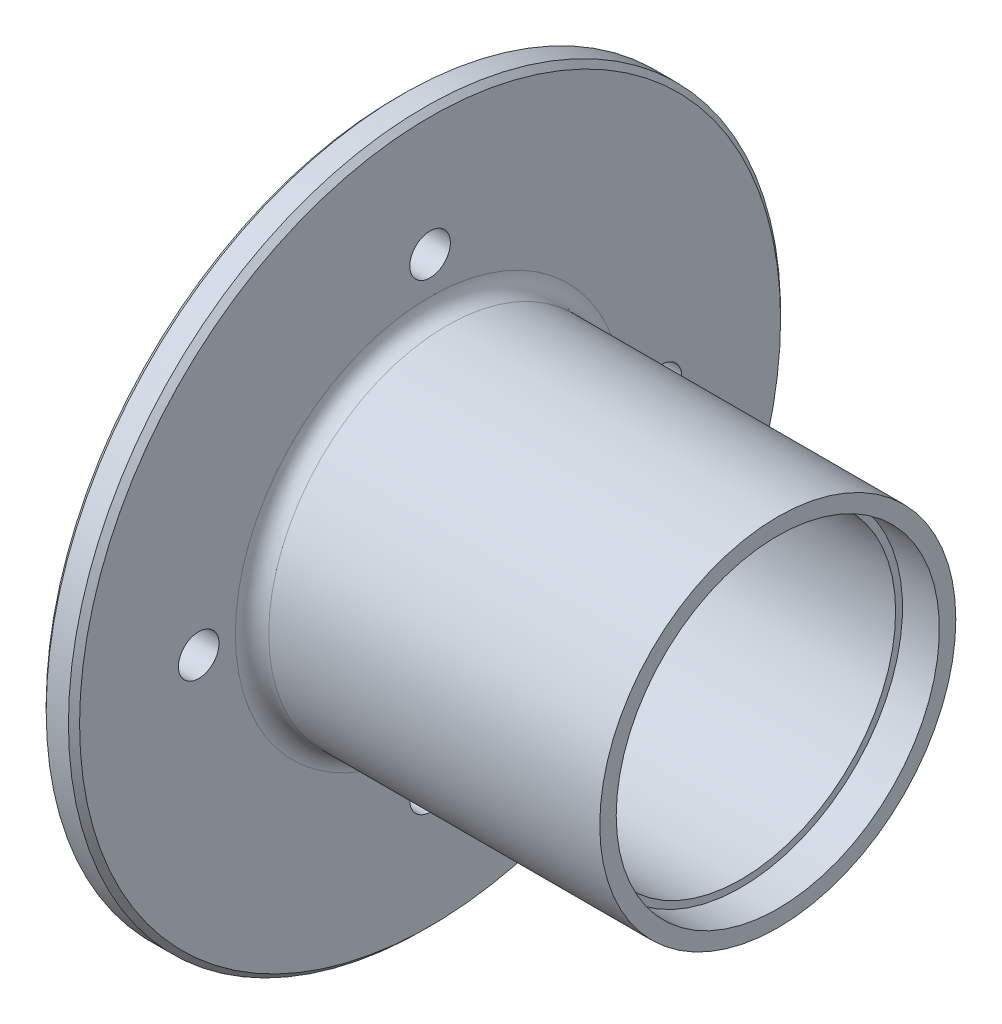
ISO-10303-21;
HEADER;
FILE_DESCRIPTION(('STEP AP214'),'2;1');
FILE_NAME('part.step','',(''),(''),'','','');
FILE_SCHEMA(('AUTOMOTIVE_DESIGN { 1 0 10303 214 1 1 1 1 }'));
ENDSEC;
DATA;
#1=APPLICATION_CONTEXT('core data for automotive mechanical design processes');
#2=APPLICATION_PROTOCOL_DEFINITION('international standard','automotive_design',2000,#1);
#3=PRODUCT_CONTEXT('',#1,'mechanical');
#4=PRODUCT('Part','Part','',(#3));
#5=PRODUCT_RELATED_PRODUCT_CATEGORY('part','',(#4));
#6=PRODUCT_DEFINITION_FORMATION('','',#4);
#7=PRODUCT_DEFINITION_CONTEXT('part definition',#1,'design');
#8=PRODUCT_DEFINITION('design','',#6,#7);
#9=PRODUCT_DEFINITION_SHAPE('','',#8);
#10=(LENGTH_UNIT() NAMED_UNIT(*) SI_UNIT(.MILLI.,.METRE.));
#11=(NAMED_UNIT(*) PLANE_ANGLE_UNIT() SI_UNIT($,.RADIAN.));
#12=(NAMED_UNIT(*) SI_UNIT($,.STERADIAN.) SOLID_ANGLE_UNIT());
#13=UNCERTAINTY_MEASURE_WITH_UNIT(LENGTH_MEASURE(1.E-05),#10,'distance_accuracy_value','');
#14=(GEOMETRIC_REPRESENTATION_CONTEXT(3) GLOBAL_UNCERTAINTY_ASSIGNED_CONTEXT((#13)) GLOBAL_UNIT_ASSIGNED_CONTEXT((#10,
#11,#12)) REPRESENTATION_CONTEXT('',''));
#15=CARTESIAN_POINT('',(0.,0.,0.));
#16=DIRECTION('',(0.,0.,1.));
#17=DIRECTION('',(1.,0.,0.));
#18=AXIS2_PLACEMENT_3D('',#15,#16,#17);
#19=CARTESIAN_POINT('',(57.7375730817676,23.0621980210306,0.));
#20=DIRECTION('',(-1.,0.,0.));
#21=DIRECTION('',(0.,0.,1.));
#22=AXIS2_PLACEMENT_3D('',#19,#20,#21);
#23=PLANE('',#22);
#24=CARTESIAN_POINT('',(57.7375730817676,0.,0.));
#25=DIRECTION('',(-1.,0.,0.));
#26=DIRECTION('',(0.,0.,1.));
#27=AXIS2_PLACEMENT_3D('',#24,#25,#26);
#28=CIRCLE('',#27,25.4102543094673);
#29=CARTESIAN_POINT('',(57.7375730817676,0.,25.4102543094673));
#30=VERTEX_POINT('',#29);
#31=EDGE_CURVE('E10',#30,#30,#28,.T.);
#32=ORIENTED_EDGE('',*,*,#31,.F.);
#33=EDGE_LOOP('',(#32));
#34=FACE_BOUND('',#33,.T.);
#35=CARTESIAN_POINT('',(57.7375730817676,0.,0.));
#36=DIRECTION('',(-1.,0.,0.));
#37=DIRECTION('',(0.,0.,1.));
#38=AXIS2_PLACEMENT_3D('',#35,#36,#37);
#39=CIRCLE('',#38,23.0621980210306);
#40=CARTESIAN_POINT('',(57.7375730817676,0.,23.0621980210306));
#41=VERTEX_POINT('',#40);
#42=EDGE_CURVE('E100',#41,#41,#39,.T.);
#43=ORIENTED_EDGE('',*,*,#42,.T.);
#44=EDGE_LOOP('',(#43));
#45=FACE_BOUND('',#44,.T.);
#46=ADVANCED_FACE('F37',(#34,#45),#23,.F.);
#47=CARTESIAN_POINT('',(0.,0.,0.));
#48=DIRECTION('',(-1.,0.,0.));
#49=DIRECTION('',(0.,0.,1.));
#50=AXIS2_PLACEMENT_3D('',#47,#48,#49);
#51=CYLINDRICAL_SURFACE('',#50,25.4102543094673);
#52=CARTESIAN_POINT('',(10.4935730817675,0.,0.));
#53=DIRECTION('',(-1.,0.,0.));
#54=DIRECTION('',(0.,0.,1.));
#55=AXIS2_PLACEMENT_3D('',#52,#53,#54);
#56=CIRCLE('',#55,25.4102543094673);
#57=CARTESIAN_POINT('',(10.4935730817675,0.,25.4102543094673));
#58=VERTEX_POINT('',#57);
#59=EDGE_CURVE('E44',#58,#58,#56,.T.);
#60=ORIENTED_EDGE('',*,*,#59,.F.);
#61=EDGE_LOOP('',(#60));
#62=FACE_BOUND('',#61,.T.);
#63=ORIENTED_EDGE('',*,*,#31,.T.);
#64=EDGE_LOOP('',(#63));
#65=FACE_BOUND('',#64,.T.);
#66=ADVANCED_FACE('F182',(#62,#65),#51,.T.);
#67=CARTESIAN_POINT('',(10.4935730817675,0.,0.));
#68=DIRECTION('',(-1.,0.,0.));
#69=DIRECTION('',(0.,0.,1.));
#70=AXIS2_PLACEMENT_3D('',#67,#68,#69);
#71=TOROIDAL_SURFACE('',#70,27.7924656509799,2.38221134151256);
#72=ORIENTED_EDGE('',*,*,#59,.T.);
#73=EDGE_LOOP('',(#72));
#74=FACE_BOUND('',#73,.T.);
#75=CARTESIAN_POINT('',(8.11136174025498,0.,0.));
#76=DIRECTION('',(-1.,0.,0.));
#77=DIRECTION('',(0.,0.,1.));
#78=AXIS2_PLACEMENT_3D('',#75,#76,#77);
#79=CIRCLE('',#78,27.7924656509799);
#80=CARTESIAN_POINT('',(8.11136174025498,0.,27.7924656509799));
#81=VERTEX_POINT('',#80);
#82=EDGE_CURVE('E49',#81,#81,#79,.T.);
#83=ORIENTED_EDGE('',*,*,#82,.F.);
#84=EDGE_LOOP('',(#83));
#85=FACE_BOUND('',#84,.T.);
#86=ADVANCED_FACE('F176',(#74,#85),#71,.F.);
#87=CARTESIAN_POINT('',(8.11136174025498,27.7924656509799,0.));
#88=DIRECTION('',(-1.,0.,0.));
#89=DIRECTION('',(0.,0.,1.));
#90=AXIS2_PLACEMENT_3D('',#87,#88,#89);
#91=PLANE('',#90);
#92=CARTESIAN_POINT('',(8.11136174025498,3.45866141425801E-13,33.02));
#93=DIRECTION('',(-1.,0.,0.));
#94=DIRECTION('',(0.,0.,1.));
#95=AXIS2_PLACEMENT_3D('',#92,#93,#94);
#96=CIRCLE('',#95,2.8956);
#97=CARTESIAN_POINT('',(8.11136174025498,3.45866141425801E-13,35.9156));
#98=VERTEX_POINT('',#97);
#99=EDGE_CURVE('E128',#98,#98,#96,.T.);
#100=ORIENTED_EDGE('',*,*,#99,.T.);
#101=EDGE_LOOP('',(#100));
#102=FACE_BOUND('',#101,.T.);
#103=CARTESIAN_POINT('',(8.11136174025498,-33.02,0.));
#104=DIRECTION('',(-1.,0.,0.));
#105=DIRECTION('',(0.,0.,1.));
#106=AXIS2_PLACEMENT_3D('',#103,#104,#105);
#107=CIRCLE('',#106,2.8956);
#108=CARTESIAN_POINT('',(8.11136174025498,-33.02,2.8956));
#109=VERTEX_POINT('',#108);
#110=EDGE_CURVE('E120',#109,#109,#107,.T.);
#111=ORIENTED_EDGE('',*,*,#110,.T.);
#112=EDGE_LOOP('',(#111));
#113=FACE_BOUND('',#112,.T.);
#114=CARTESIAN_POINT('',(8.11136174025498,-1.152887138086E-13,-33.02));
#115=DIRECTION('',(-1.,0.,0.));
#116=DIRECTION('',(0.,0.,1.));
#117=AXIS2_PLACEMENT_3D('',#114,#115,#116);
#118=CIRCLE('',#117,2.8956);
#119=CARTESIAN_POINT('',(8.11136174025498,-1.152887138086E-13,-30.1244));
#120=VERTEX_POINT('',#119);
#121=EDGE_CURVE('E112',#120,#120,#118,.T.);
#122=ORIENTED_EDGE('',*,*,#121,.T.);
#123=EDGE_LOOP('',(#122));
#124=FACE_BOUND('',#123,.T.);
#125=CARTESIAN_POINT('',(8.11136174025498,33.02,0.));
#126=DIRECTION('',(-1.,0.,0.));
#127=DIRECTION('',(0.,0.,1.));
#128=AXIS2_PLACEMENT_3D('',#125,#126,#127);
#129=CIRCLE('',#128,2.89559999999999);
#130=CARTESIAN_POINT('',(8.11136174025498,33.02,2.89559999999999));
#131=VERTEX_POINT('',#130);
#132=EDGE_CURVE('E104',#131,#131,#129,.T.);
#133=ORIENTED_EDGE('',*,*,#132,.T.);
#134=EDGE_LOOP('',(#133));
#135=FACE_BOUND('',#134,.T.);
#136=CARTESIAN_POINT('',(8.11136174025498,0.,0.));
#137=DIRECTION('',(-1.,0.,0.));
#138=DIRECTION('',(0.,0.,1.));
#139=AXIS2_PLACEMENT_3D('',#136,#137,#138);
#140=CIRCLE('',#139,50.0264381717638);
#141=CARTESIAN_POINT('',(8.11136174025498,0.,50.0264381717638));
#142=VERTEX_POINT('',#141);
#143=EDGE_CURVE('E54',#142,#142,#140,.T.);
#144=ORIENTED_EDGE('',*,*,#143,.F.);
#145=EDGE_LOOP('',(#144));
#146=FACE_BOUND('',#145,.T.);
#147=ORIENTED_EDGE('',*,*,#82,.T.);
#148=EDGE_LOOP('',(#147));
#149=FACE_BOUND('',#148,.T.);
#150=ADVANCED_FACE('F170',(#102,#113,#124,#135,#146,#149),#91,.F.);
#151=CARTESIAN_POINT('',(8.11136174025498,0.,0.));
#152=DIRECTION('',(-1.,0.,0.));
#153=DIRECTION('',(0.,0.,1.));
#154=AXIS2_PLACEMENT_3D('',#151,#152,#153);
#155=CONICAL_SURFACE('',#154,50.0264381717638,0.785398163397448);
#156=CARTESIAN_POINT('',(7.31729129308412,0.,0.));
#157=DIRECTION('',(-1.,0.,0.));
#158=DIRECTION('',(0.,0.,1.));
#159=AXIS2_PLACEMENT_3D('',#156,#157,#158);
#160=CIRCLE('',#159,50.8205086189346);
#161=CARTESIAN_POINT('',(7.31729129308412,0.,50.8205086189346));
#162=VERTEX_POINT('',#161);
#163=EDGE_CURVE('E60',#162,#162,#160,.T.);
#164=ORIENTED_EDGE('',*,*,#163,.F.);
#165=EDGE_LOOP('',(#164));
#166=FACE_BOUND('',#165,.T.);
#167=ORIENTED_EDGE('',*,*,#143,.T.);
#168=EDGE_LOOP('',(#167));
#169=FACE_BOUND('',#168,.T.);
#170=ADVANCED_FACE('F164',(#166,#169),#155,.T.);
#171=CARTESIAN_POINT('',(0.,0.,0.));
#172=DIRECTION('',(-1.,0.,0.));
#173=DIRECTION('',(0.,0.,1.));
#174=AXIS2_PLACEMENT_3D('',#171,#172,#173);
#175=CYLINDRICAL_SURFACE('',#174,50.8205086189346);
#176=CARTESIAN_POINT('',(4.14100950440072,0.,0.));
#177=DIRECTION('',(-1.,0.,0.));
#178=DIRECTION('',(0.,0.,1.));
#179=AXIS2_PLACEMENT_3D('',#176,#177,#178);
#180=CIRCLE('',#179,50.8205086189346);
#181=CARTESIAN_POINT('',(4.14100950440072,0.,50.8205086189346));
#182=VERTEX_POINT('',#181);
#183=EDGE_CURVE('E64',#182,#182,#180,.T.);
#184=ORIENTED_EDGE('',*,*,#183,.F.);
#185=EDGE_LOOP('',(#184));
#186=FACE_BOUND('',#185,.T.);
#187=ORIENTED_EDGE('',*,*,#163,.T.);
#188=EDGE_LOOP('',(#187));
#189=FACE_BOUND('',#188,.T.);
#190=ADVANCED_FACE('F158',(#186,#189),#175,.T.);
#191=CARTESIAN_POINT('',(4.14100950440072,0.,0.));
#192=DIRECTION('',(1.,0.,0.));
#193=DIRECTION('',(0.,0.,-1.));
#194=AXIS2_PLACEMENT_3D('',#191,#192,#193);
#195=CONICAL_SURFACE('',#194,50.8205086189346,0.785398163397448);
#196=CARTESIAN_POINT('',(3.34693905722985,0.,0.));
#197=DIRECTION('',(-1.,0.,0.));
#198=DIRECTION('',(0.,0.,1.));
#199=AXIS2_PLACEMENT_3D('',#196,#197,#198);
#200=CIRCLE('',#199,50.0264381717638);
#201=CARTESIAN_POINT('',(3.34693905722985,0.,50.0264381717638));
#202=VERTEX_POINT('',#201);
#203=EDGE_CURVE('E68',#202,#202,#200,.T.);
#204=ORIENTED_EDGE('',*,*,#203,.F.);
#205=EDGE_LOOP('',(#204));
#206=FACE_BOUND('',#205,.T.);
#207=ORIENTED_EDGE('',*,*,#183,.T.);
#208=EDGE_LOOP('',(#207));
#209=FACE_BOUND('',#208,.T.);
#210=ADVANCED_FACE('F144',(#206,#209),#195,.T.);
#211=CARTESIAN_POINT('',(3.34693905722985,50.0264381717638,0.));
#212=DIRECTION('',(1.,0.,0.));
#213=DIRECTION('',(0.,0.,-1.));
#214=AXIS2_PLACEMENT_3D('',#211,#212,#213);
#215=PLANE('',#214);
#216=CARTESIAN_POINT('',(3.34693905722985,3.45866141425801E-13,33.02));
#217=DIRECTION('',(-1.,0.,0.));
#218=DIRECTION('',(0.,0.,1.));
#219=AXIS2_PLACEMENT_3D('',#216,#217,#218);
#220=CIRCLE('',#219,2.8956);
#221=CARTESIAN_POINT('',(3.34693905722985,3.45866141425801E-13,35.9156));
#222=VERTEX_POINT('',#221);
#223=EDGE_CURVE('E132',#222,#222,#220,.T.);
#224=ORIENTED_EDGE('',*,*,#223,.F.);
#225=EDGE_LOOP('',(#224));
#226=FACE_BOUND('',#225,.T.);
#227=CARTESIAN_POINT('',(3.34693905722985,-33.02,0.));
#228=DIRECTION('',(-1.,0.,0.));
#229=DIRECTION('',(0.,0.,1.));
#230=AXIS2_PLACEMENT_3D('',#227,#228,#229);
#231=CIRCLE('',#230,2.8956);
#232=CARTESIAN_POINT('',(3.34693905722985,-33.02,2.8956));
#233=VERTEX_POINT('',#232);
#234=EDGE_CURVE('E124',#233,#233,#231,.T.);
#235=ORIENTED_EDGE('',*,*,#234,.F.);
#236=EDGE_LOOP('',(#235));
#237=FACE_BOUND('',#236,.T.);
#238=CARTESIAN_POINT('',(3.34693905722985,-1.152887138086E-13,-33.02));
#239=DIRECTION('',(-1.,0.,0.));
#240=DIRECTION('',(0.,0.,1.));
#241=AXIS2_PLACEMENT_3D('',#238,#239,#240);
#242=CIRCLE('',#241,2.8956);
#243=CARTESIAN_POINT('',(3.34693905722985,-1.152887138086E-13,-30.1244));
#244=VERTEX_POINT('',#243);
#245=EDGE_CURVE('E116',#244,#244,#242,.T.);
#246=ORIENTED_EDGE('',*,*,#245,.F.);
#247=EDGE_LOOP('',(#246));
#248=FACE_BOUND('',#247,.T.);
#249=CARTESIAN_POINT('',(3.34693905722985,33.02,0.));
#250=DIRECTION('',(-1.,0.,0.));
#251=DIRECTION('',(0.,0.,1.));
#252=AXIS2_PLACEMENT_3D('',#249,#250,#251);
#253=CIRCLE('',#252,2.8956);
#254=CARTESIAN_POINT('',(3.34693905722985,33.02,2.8956));
#255=VERTEX_POINT('',#254);
#256=EDGE_CURVE('E108',#255,#255,#253,.T.);
#257=ORIENTED_EDGE('',*,*,#256,.F.);
#258=EDGE_LOOP('',(#257));
#259=FACE_BOUND('',#258,.T.);
#260=CARTESIAN_POINT('',(3.34693905722985,0.,0.));
#261=DIRECTION('',(-1.,0.,0.));
#262=DIRECTION('',(0.,0.,1.));
#263=AXIS2_PLACEMENT_3D('',#260,#261,#262);
#264=CIRCLE('',#263,17.1502721287435);
#265=CARTESIAN_POINT('',(3.34693905722985,0.,17.1502721287435));
#266=VERTEX_POINT('',#265);
#267=EDGE_CURVE('E72',#266,#266,#264,.T.);
#268=ORIENTED_EDGE('',*,*,#267,.F.);
#269=EDGE_LOOP('',(#268));
#270=FACE_BOUND('',#269,.T.);
#271=ORIENTED_EDGE('',*,*,#203,.T.);
#272=EDGE_LOOP('',(#271));
#273=FACE_BOUND('',#272,.T.);
#274=ADVANCED_FACE('F140',(#226,#237,#248,#259,#270,#273),#215,.F.);
#275=CARTESIAN_POINT('',(3.34693905722985,0.,0.));
#276=DIRECTION('',(-1.,0.,0.));
#277=DIRECTION('',(0.,0.,1.));
#278=AXIS2_PLACEMENT_3D('',#275,#276,#277);
#279=CONICAL_SURFACE('',#278,17.1502721287435,0.767642261232656);
#280=CARTESIAN_POINT('',(8.11136174025498,0.,0.));
#281=DIRECTION('',(-1.,0.,0.));
#282=DIRECTION('',(0.,0.,1.));
#283=AXIS2_PLACEMENT_3D('',#280,#281,#282);
#284=CIRCLE('',#283,12.5521080921244);
#285=CARTESIAN_POINT('',(8.11136174025498,0.,12.5521080921244));
#286=VERTEX_POINT('',#285);
#287=EDGE_CURVE('E76',#286,#286,#284,.T.);
#288=ORIENTED_EDGE('',*,*,#287,.F.);
#289=EDGE_LOOP('',(#288));
#290=FACE_BOUND('',#289,.T.);
#291=ORIENTED_EDGE('',*,*,#267,.T.);
#292=EDGE_LOOP('',(#291));
#293=FACE_BOUND('',#292,.T.);
#294=ADVANCED_FACE('F143',(#290,#293),#279,.F.);
#295=CARTESIAN_POINT('',(8.11136174025498,12.5521080921244,0.));
#296=DIRECTION('',(-1.,0.,0.));
#297=DIRECTION('',(0.,0.,1.));
#298=AXIS2_PLACEMENT_3D('',#295,#296,#297);
#299=PLANE('',#298);
#300=CARTESIAN_POINT('',(8.11136174025498,0.,0.));
#301=DIRECTION('',(-1.,0.,0.));
#302=DIRECTION('',(0.,0.,1.));
#303=AXIS2_PLACEMENT_3D('',#300,#301,#302);
#304=CIRCLE('',#303,17.1502721287435);
#305=CARTESIAN_POINT('',(8.11136174025498,0.,17.1502721287435));
#306=VERTEX_POINT('',#305);
#307=EDGE_CURVE('E80',#306,#306,#304,.T.);
#308=ORIENTED_EDGE('',*,*,#307,.F.);
#309=EDGE_LOOP('',(#308));
#310=FACE_BOUND('',#309,.T.);
#311=ORIENTED_EDGE('',*,*,#287,.T.);
#312=EDGE_LOOP('',(#311));
#313=FACE_BOUND('',#312,.T.);
#314=ADVANCED_FACE('F223',(#310,#313),#299,.F.);
#315=CARTESIAN_POINT('',(0.,0.,0.));
#316=DIRECTION('',(-1.,0.,0.));
#317=DIRECTION('',(0.,0.,1.));
#318=AXIS2_PLACEMENT_3D('',#315,#316,#317);
#319=CYLINDRICAL_SURFACE('',#318,17.1502721287435);
#320=CARTESIAN_POINT('',(23.5579308541441,0.,0.));
#321=DIRECTION('',(-1.,0.,0.));
#322=DIRECTION('',(0.,0.,1.));
#323=AXIS2_PLACEMENT_3D('',#320,#321,#322);
#324=CIRCLE('',#323,17.1502721287435);
#325=CARTESIAN_POINT('',(23.5579308541441,0.,17.1502721287435));
#326=VERTEX_POINT('',#325);
#327=EDGE_CURVE('E84',#326,#326,#324,.T.);
#328=ORIENTED_EDGE('',*,*,#327,.F.);
#329=EDGE_LOOP('',(#328));
#330=FACE_BOUND('',#329,.T.);
#331=ORIENTED_EDGE('',*,*,#307,.T.);
#332=EDGE_LOOP('',(#331));
#333=FACE_BOUND('',#332,.T.);
#334=ADVANCED_FACE('F217',(#330,#333),#319,.F.);
#335=CARTESIAN_POINT('',(23.5579308541441,17.1502721287435,0.));
#336=DIRECTION('',(-1.,0.,0.));
#337=DIRECTION('',(0.,0.,1.));
#338=AXIS2_PLACEMENT_3D('',#335,#336,#337);
#339=PLANE('',#338);
#340=CARTESIAN_POINT('',(23.5579308541441,0.,0.));
#341=DIRECTION('',(-1.,0.,0.));
#342=DIRECTION('',(0.,0.,1.));
#343=AXIS2_PLACEMENT_3D('',#340,#341,#342);
#344=CIRCLE('',#343,22.076877202864);
#345=CARTESIAN_POINT('',(23.5579308541441,0.,22.076877202864));
#346=VERTEX_POINT('',#345);
#347=EDGE_CURVE('E88',#346,#346,#344,.T.);
#348=ORIENTED_EDGE('',*,*,#347,.F.);
#349=EDGE_LOOP('',(#348));
#350=FACE_BOUND('',#349,.T.);
#351=ORIENTED_EDGE('',*,*,#327,.T.);
#352=EDGE_LOOP('',(#351));
#353=FACE_BOUND('',#352,.T.);
#354=ADVANCED_FACE('F211',(#350,#353),#339,.F.);
#355=CARTESIAN_POINT('',(0.,0.,0.));
#356=DIRECTION('',(-1.,0.,0.));
#357=DIRECTION('',(0.,0.,1.));
#358=AXIS2_PLACEMENT_3D('',#355,#356,#357);
#359=CYLINDRICAL_SURFACE('',#358,22.076877202864);
#360=CARTESIAN_POINT('',(52.4791662625277,0.,0.));
#361=DIRECTION('',(-1.,0.,0.));
#362=DIRECTION('',(0.,0.,1.));
#363=AXIS2_PLACEMENT_3D('',#360,#361,#362);
#364=CIRCLE('',#363,22.076877202864);
#365=CARTESIAN_POINT('',(52.4791662625277,0.,22.076877202864));
#366=VERTEX_POINT('',#365);
#367=EDGE_CURVE('E92',#366,#366,#364,.T.);
#368=ORIENTED_EDGE('',*,*,#367,.F.);
#369=EDGE_LOOP('',(#368));
#370=FACE_BOUND('',#369,.T.);
#371=ORIENTED_EDGE('',*,*,#347,.T.);
#372=EDGE_LOOP('',(#371));
#373=FACE_BOUND('',#372,.T.);
#374=ADVANCED_FACE('F205',(#370,#373),#359,.F.);
#375=CARTESIAN_POINT('',(52.4791662625277,22.076877202864,0.));
#376=DIRECTION('',(-1.,0.,0.));
#377=DIRECTION('',(0.,0.,1.));
#378=AXIS2_PLACEMENT_3D('',#375,#376,#377);
#379=PLANE('',#378);
#380=CARTESIAN_POINT('',(52.4791662625277,0.,0.));
#381=DIRECTION('',(-1.,0.,0.));
#382=DIRECTION('',(0.,0.,1.));
#383=AXIS2_PLACEMENT_3D('',#380,#381,#382);
#384=CIRCLE('',#383,23.0621980210306);
#385=CARTESIAN_POINT('',(52.4791662625277,0.,23.0621980210306));
#386=VERTEX_POINT('',#385);
#387=EDGE_CURVE('E96',#386,#386,#384,.T.);
#388=ORIENTED_EDGE('',*,*,#387,.F.);
#389=EDGE_LOOP('',(#388));
#390=FACE_BOUND('',#389,.T.);
#391=ORIENTED_EDGE('',*,*,#367,.T.);
#392=EDGE_LOOP('',(#391));
#393=FACE_BOUND('',#392,.T.);
#394=ADVANCED_FACE('F199',(#390,#393),#379,.F.);
#395=CARTESIAN_POINT('',(0.,0.,0.));
#396=DIRECTION('',(-1.,0.,0.));
#397=DIRECTION('',(0.,0.,1.));
#398=AXIS2_PLACEMENT_3D('',#395,#396,#397);
#399=CYLINDRICAL_SURFACE('',#398,23.0621980210306);
#400=ORIENTED_EDGE('',*,*,#42,.F.);
#401=EDGE_LOOP('',(#400));
#402=FACE_BOUND('',#401,.T.);
#403=ORIENTED_EDGE('',*,*,#387,.T.);
#404=EDGE_LOOP('',(#403));
#405=FACE_BOUND('',#404,.T.);
#406=ADVANCED_FACE('F195',(#402,#405),#399,.F.);
#407=CARTESIAN_POINT('',(3.34693905722985,33.02,0.));
#408=DIRECTION('',(-1.,0.,0.));
#409=DIRECTION('',(0.,0.,1.));
#410=AXIS2_PLACEMENT_3D('',#407,#408,#409);
#411=CYLINDRICAL_SURFACE('',#410,2.89559999999999);
#412=ORIENTED_EDGE('',*,*,#256,.T.);
#413=EDGE_LOOP('',(#412));
#414=FACE_BOUND('',#413,.T.);
#415=ORIENTED_EDGE('',*,*,#132,.F.);
#416=EDGE_LOOP('',(#415));
#417=FACE_BOUND('',#416,.T.);
#418=ADVANCED_FACE('F198',(#414,#417),#411,.F.);
#419=CARTESIAN_POINT('',(3.34693905722985,-1.152887138086E-13,-33.02));
#420=DIRECTION('',(-1.,0.,0.));
#421=DIRECTION('',(0.,0.,1.));
#422=AXIS2_PLACEMENT_3D('',#419,#420,#421);
#423=CYLINDRICAL_SURFACE('',#422,2.8956);
#424=ORIENTED_EDGE('',*,*,#245,.T.);
#425=EDGE_LOOP('',(#424));
#426=FACE_BOUND('',#425,.T.);
#427=ORIENTED_EDGE('',*,*,#121,.F.);
#428=EDGE_LOOP('',(#427));
#429=FACE_BOUND('',#428,.T.);
#430=ADVANCED_FACE('F240',(#426,#429),#423,.F.);
#431=CARTESIAN_POINT('',(3.34693905722985,-33.02,0.));
#432=DIRECTION('',(-1.,0.,0.));
#433=DIRECTION('',(0.,0.,1.));
#434=AXIS2_PLACEMENT_3D('',#431,#432,#433);
#435=CYLINDRICAL_SURFACE('',#434,2.8956);
#436=ORIENTED_EDGE('',*,*,#234,.T.);
#437=EDGE_LOOP('',(#436));
#438=FACE_BOUND('',#437,.T.);
#439=ORIENTED_EDGE('',*,*,#110,.F.);
#440=EDGE_LOOP('',(#439));
#441=FACE_BOUND('',#440,.T.);
#442=ADVANCED_FACE('F244',(#438,#441),#435,.F.);
#443=CARTESIAN_POINT('',(3.34693905722985,3.45866141425801E-13,33.02));
#444=DIRECTION('',(-1.,0.,0.));
#445=DIRECTION('',(0.,0.,1.));
#446=AXIS2_PLACEMENT_3D('',#443,#444,#445);
#447=CYLINDRICAL_SURFACE('',#446,2.8956);
#448=ORIENTED_EDGE('',*,*,#223,.T.);
#449=EDGE_LOOP('',(#448));
#450=FACE_BOUND('',#449,.T.);
#451=ORIENTED_EDGE('',*,*,#99,.F.);
#452=EDGE_LOOP('',(#451));
#453=FACE_BOUND('',#452,.T.);
#454=ADVANCED_FACE('F137',(#450,#453),#447,.F.);
#455=CLOSED_SHELL('',(#46,#66,#86,#150,#170,#190,#210,#274,#294,#314,#334,#354,#374,#394,#406,
#418,#430,#442,#454));
#456=MANIFOLD_SOLID_BREP('B2',#455);
#457=ADVANCED_BREP_SHAPE_REPRESENTATION('',(#18,#456),#14);
#458=SHAPE_DEFINITION_REPRESENTATION(#9,#457);
ENDSEC;
END-ISO-10303-21;
